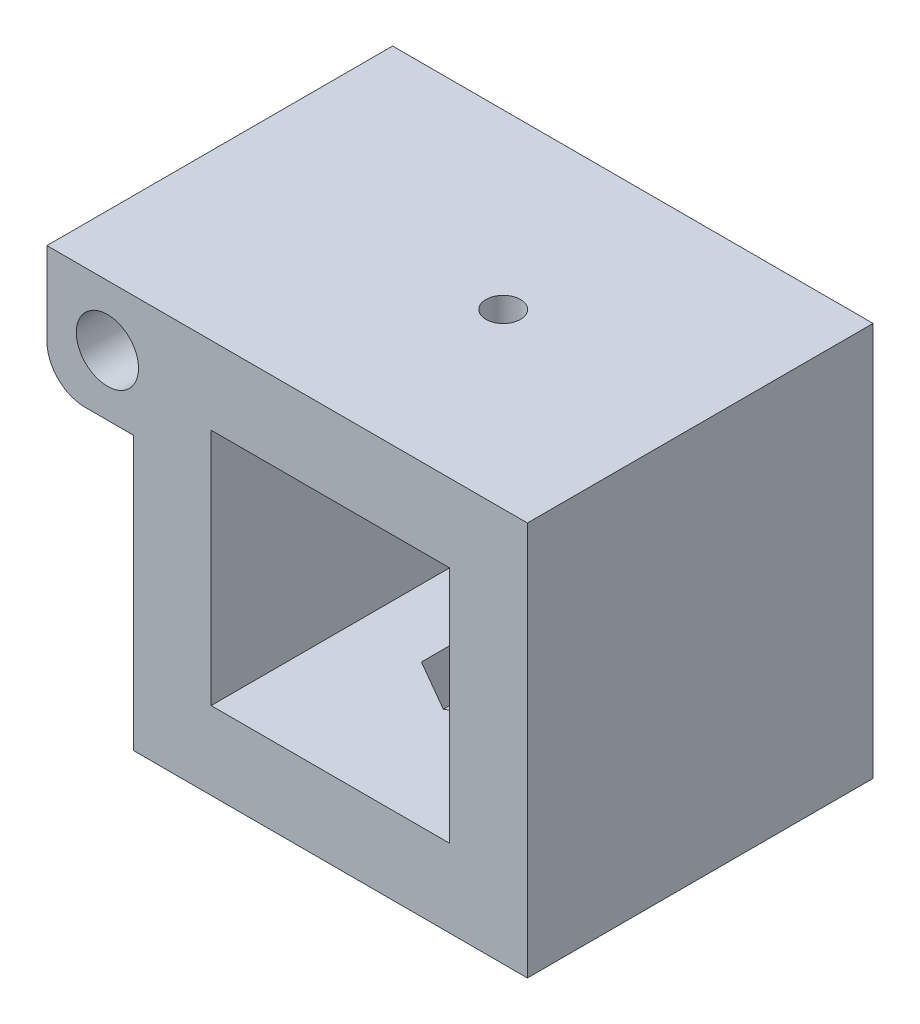
ISO-10303-21;
HEADER;
FILE_DESCRIPTION(('STEP AP214'),'2;1');
FILE_NAME('part.step','',(''),(''),'','','');
FILE_SCHEMA(('AUTOMOTIVE_DESIGN { 1 0 10303 214 1 1 1 1 }'));
ENDSEC;
DATA;
#1=APPLICATION_CONTEXT('core data for automotive mechanical design processes');
#2=APPLICATION_PROTOCOL_DEFINITION('international standard','automotive_design',2000,#1);
#3=PRODUCT_CONTEXT('',#1,'mechanical');
#4=PRODUCT('Part','Part','',(#3));
#5=PRODUCT_RELATED_PRODUCT_CATEGORY('part','',(#4));
#6=PRODUCT_DEFINITION_FORMATION('','',#4);
#7=PRODUCT_DEFINITION_CONTEXT('part definition',#1,'design');
#8=PRODUCT_DEFINITION('design','',#6,#7);
#9=PRODUCT_DEFINITION_SHAPE('','',#8);
#10=(LENGTH_UNIT() NAMED_UNIT(*) SI_UNIT(.MILLI.,.METRE.));
#11=(NAMED_UNIT(*) PLANE_ANGLE_UNIT() SI_UNIT($,.RADIAN.));
#12=(NAMED_UNIT(*) SI_UNIT($,.STERADIAN.) SOLID_ANGLE_UNIT());
#13=UNCERTAINTY_MEASURE_WITH_UNIT(LENGTH_MEASURE(1.E-05),#10,'distance_accuracy_value','');
#14=(GEOMETRIC_REPRESENTATION_CONTEXT(3) GLOBAL_UNCERTAINTY_ASSIGNED_CONTEXT((#13)) GLOBAL_UNIT_ASSIGNED_CONTEXT((#10,
#11,#12)) REPRESENTATION_CONTEXT('',''));
#15=CARTESIAN_POINT('',(0.,0.,0.));
#16=DIRECTION('',(0.,0.,1.));
#17=DIRECTION('',(1.,0.,0.));
#18=AXIS2_PLACEMENT_3D('',#15,#16,#17);
#19=CARTESIAN_POINT('',(0.,0.,10.));
#20=DIRECTION('',(0.,0.,1.));
#21=DIRECTION('',(1.,0.,0.));
#22=AXIS2_PLACEMENT_3D('',#19,#20,#21);
#23=PLANE('',#22);
#24=DIRECTION('',(-1.,0.,0.));
#25=VECTOR('',#24,1.);
#26=CARTESIAN_POINT('',(-6.9,6.9,10.));
#27=LINE('',#26,#25);
#28=CARTESIAN_POINT('',(6.9,6.9,10.));
#29=VERTEX_POINT('',#28);
#30=CARTESIAN_POINT('',(-6.9,6.9,10.));
#31=VERTEX_POINT('',#30);
#32=EDGE_CURVE('E246',#29,#31,#27,.T.);
#33=ORIENTED_EDGE('',*,*,#32,.F.);
#34=DIRECTION('',(0.,1.,0.));
#35=VECTOR('',#34,1.);
#36=CARTESIAN_POINT('',(6.9,-6.9,10.));
#37=LINE('',#36,#35);
#38=CARTESIAN_POINT('',(6.9,-6.9,10.));
#39=VERTEX_POINT('',#38);
#40=EDGE_CURVE('E244',#39,#29,#37,.T.);
#41=ORIENTED_EDGE('',*,*,#40,.F.);
#42=DIRECTION('',(1.,0.,0.));
#43=VECTOR('',#42,1.);
#44=CARTESIAN_POINT('',(-6.9,-6.9,10.));
#45=LINE('',#44,#43);
#46=CARTESIAN_POINT('',(-6.9,-6.9,10.));
#47=VERTEX_POINT('',#46);
#48=EDGE_CURVE('E252',#47,#39,#45,.T.);
#49=ORIENTED_EDGE('',*,*,#48,.F.);
#50=DIRECTION('',(0.,-1.,0.));
#51=VECTOR('',#50,1.);
#52=CARTESIAN_POINT('',(-6.9,-6.9,10.));
#53=LINE('',#52,#51);
#54=EDGE_CURVE('E249',#31,#47,#53,.T.);
#55=ORIENTED_EDGE('',*,*,#54,.F.);
#56=EDGE_LOOP('',(#33,#41,#49,#55));
#57=FACE_BOUND('',#56,.T.);
#58=DIRECTION('',(0.,-1.,0.));
#59=VECTOR('',#58,1.);
#60=CARTESIAN_POINT('',(-16.4,0.,10.));
#61=LINE('',#60,#59);
#62=CARTESIAN_POINT('',(-16.4,11.4,10.));
#63=VERTEX_POINT('',#62);
#64=CARTESIAN_POINT('',(-16.4,6.6,10.));
#65=VERTEX_POINT('',#64);
#66=EDGE_CURVE('E173',#63,#65,#61,.T.);
#67=ORIENTED_EDGE('',*,*,#66,.T.);
#68=CARTESIAN_POINT('',(-14.2,6.6,10.));
#69=DIRECTION('',(0.,0.,1.));
#70=DIRECTION('',(1.,0.,0.));
#71=AXIS2_PLACEMENT_3D('',#68,#69,#70);
#72=CIRCLE('',#71,2.2);
#73=CARTESIAN_POINT('',(-14.2,4.4,10.));
#74=VERTEX_POINT('',#73);
#75=EDGE_CURVE('E58',#65,#74,#72,.T.);
#76=ORIENTED_EDGE('',*,*,#75,.T.);
#77=DIRECTION('',(-1.,0.,0.));
#78=VECTOR('',#77,1.);
#79=CARTESIAN_POINT('',(0.,4.4,10.));
#80=LINE('',#79,#78);
#81=CARTESIAN_POINT('',(-11.4,4.4,10.));
#82=VERTEX_POINT('',#81);
#83=EDGE_CURVE('E180',#82,#74,#80,.T.);
#84=ORIENTED_EDGE('',*,*,#83,.F.);
#85=DIRECTION('',(0.,-1.,0.));
#86=VECTOR('',#85,1.);
#87=CARTESIAN_POINT('',(-11.4,-11.4,10.));
#88=LINE('',#87,#86);
#89=CARTESIAN_POINT('',(-11.4,-11.4,10.));
#90=VERTEX_POINT('',#89);
#91=EDGE_CURVE('E282',#82,#90,#88,.T.);
#92=ORIENTED_EDGE('',*,*,#91,.T.);
#93=DIRECTION('',(1.,0.,0.));
#94=VECTOR('',#93,1.);
#95=CARTESIAN_POINT('',(-11.4,-11.4,10.));
#96=LINE('',#95,#94);
#97=CARTESIAN_POINT('',(11.4,-11.4,10.));
#98=VERTEX_POINT('',#97);
#99=EDGE_CURVE('E275',#90,#98,#96,.T.);
#100=ORIENTED_EDGE('',*,*,#99,.T.);
#101=DIRECTION('',(0.,1.,0.));
#102=VECTOR('',#101,1.);
#103=CARTESIAN_POINT('',(11.4,-11.4,10.));
#104=LINE('',#103,#102);
#105=CARTESIAN_POINT('',(11.4,11.4,10.));
#106=VERTEX_POINT('',#105);
#107=EDGE_CURVE('E278',#98,#106,#104,.T.);
#108=ORIENTED_EDGE('',*,*,#107,.T.);
#109=DIRECTION('',(-1.,0.,0.));
#110=VECTOR('',#109,1.);
#111=CARTESIAN_POINT('',(-11.4,11.4,10.));
#112=LINE('',#111,#110);
#113=EDGE_CURVE('E280',#106,#63,#112,.T.);
#114=ORIENTED_EDGE('',*,*,#113,.T.);
#115=EDGE_LOOP('',(#67,#76,#84,#92,#100,#108,#114));
#116=FACE_BOUND('',#115,.T.);
#117=CARTESIAN_POINT('',(-12.9,7.9,10.));
#118=DIRECTION('',(0.,0.,-1.));
#119=DIRECTION('',(-1.,0.,0.));
#120=AXIS2_PLACEMENT_3D('',#117,#118,#119);
#121=CIRCLE('',#120,1.79999999999999);
#122=CARTESIAN_POINT('',(-14.7,7.9,10.));
#123=VERTEX_POINT('',#122);
#124=EDGE_CURVE('E185',#123,#123,#121,.T.);
#125=ORIENTED_EDGE('',*,*,#124,.T.);
#126=EDGE_LOOP('',(#125));
#127=FACE_BOUND('',#126,.T.);
#128=ADVANCED_FACE('F35',(#57,#116,#127),#23,.T.);
#129=CARTESIAN_POINT('',(0.,0.,-10.));
#130=DIRECTION('',(0.,0.,1.));
#131=DIRECTION('',(1.,0.,0.));
#132=AXIS2_PLACEMENT_3D('',#129,#130,#131);
#133=PLANE('',#132);
#134=DIRECTION('',(0.,1.,0.));
#135=VECTOR('',#134,1.);
#136=CARTESIAN_POINT('',(6.9,-6.9,-10.));
#137=LINE('',#136,#135);
#138=CARTESIAN_POINT('',(6.9,-6.9,-10.));
#139=VERTEX_POINT('',#138);
#140=CARTESIAN_POINT('',(6.9,6.9,-10.));
#141=VERTEX_POINT('',#140);
#142=EDGE_CURVE('E233',#139,#141,#137,.T.);
#143=ORIENTED_EDGE('',*,*,#142,.T.);
#144=DIRECTION('',(-1.,0.,0.));
#145=VECTOR('',#144,1.);
#146=CARTESIAN_POINT('',(-6.9,6.9,-10.));
#147=LINE('',#146,#145);
#148=CARTESIAN_POINT('',(-6.9,6.9,-10.));
#149=VERTEX_POINT('',#148);
#150=EDGE_CURVE('E257',#141,#149,#147,.T.);
#151=ORIENTED_EDGE('',*,*,#150,.T.);
#152=DIRECTION('',(0.,-1.,0.));
#153=VECTOR('',#152,1.);
#154=CARTESIAN_POINT('',(-6.9,-6.9,-10.));
#155=LINE('',#154,#153);
#156=CARTESIAN_POINT('',(-6.9,-6.9,-10.));
#157=VERTEX_POINT('',#156);
#158=EDGE_CURVE('E260',#149,#157,#155,.T.);
#159=ORIENTED_EDGE('',*,*,#158,.T.);
#160=DIRECTION('',(1.,0.,0.));
#161=VECTOR('',#160,1.);
#162=CARTESIAN_POINT('',(-6.9,-6.9,-10.));
#163=LINE('',#162,#161);
#164=EDGE_CURVE('E247',#157,#139,#163,.T.);
#165=ORIENTED_EDGE('',*,*,#164,.T.);
#166=EDGE_LOOP('',(#143,#151,#159,#165));
#167=FACE_BOUND('',#166,.T.);
#168=DIRECTION('',(-1.,0.,0.));
#169=VECTOR('',#168,1.);
#170=CARTESIAN_POINT('',(0.,4.4,-10.));
#171=LINE('',#170,#169);
#172=CARTESIAN_POINT('',(-11.4,4.4,-10.));
#173=VERTEX_POINT('',#172);
#174=CARTESIAN_POINT('',(-14.2,4.4,-10.));
#175=VERTEX_POINT('',#174);
#176=EDGE_CURVE('E175',#173,#175,#171,.T.);
#177=ORIENTED_EDGE('',*,*,#176,.T.);
#178=CARTESIAN_POINT('',(-14.2,6.6,-10.));
#179=DIRECTION('',(0.,0.,1.));
#180=DIRECTION('',(1.,0.,0.));
#181=AXIS2_PLACEMENT_3D('',#178,#179,#180);
#182=CIRCLE('',#181,2.2);
#183=CARTESIAN_POINT('',(-16.4,6.6,-10.));
#184=VERTEX_POINT('',#183);
#185=EDGE_CURVE('E11',#175,#184,#182,.F.);
#186=ORIENTED_EDGE('',*,*,#185,.T.);
#187=DIRECTION('',(0.,-1.,0.));
#188=VECTOR('',#187,1.);
#189=CARTESIAN_POINT('',(-16.4,0.,-10.));
#190=LINE('',#189,#188);
#191=CARTESIAN_POINT('',(-16.4,11.4,-10.));
#192=VERTEX_POINT('',#191);
#193=EDGE_CURVE('E171',#192,#184,#190,.T.);
#194=ORIENTED_EDGE('',*,*,#193,.F.);
#195=DIRECTION('',(-1.,0.,0.));
#196=VECTOR('',#195,1.);
#197=CARTESIAN_POINT('',(-11.4,11.4,-10.));
#198=LINE('',#197,#196);
#199=CARTESIAN_POINT('',(11.4,11.4,-10.));
#200=VERTEX_POINT('',#199);
#201=EDGE_CURVE('E154',#200,#192,#198,.T.);
#202=ORIENTED_EDGE('',*,*,#201,.F.);
#203=DIRECTION('',(0.,1.,0.));
#204=VECTOR('',#203,1.);
#205=CARTESIAN_POINT('',(11.4,-11.4,-10.));
#206=LINE('',#205,#204);
#207=CARTESIAN_POINT('',(11.4,-11.4,-10.));
#208=VERTEX_POINT('',#207);
#209=EDGE_CURVE('E165',#208,#200,#206,.T.);
#210=ORIENTED_EDGE('',*,*,#209,.F.);
#211=DIRECTION('',(1.,0.,0.));
#212=VECTOR('',#211,1.);
#213=CARTESIAN_POINT('',(-11.4,-11.4,-10.));
#214=LINE('',#213,#212);
#215=CARTESIAN_POINT('',(-11.4,-11.4,-10.));
#216=VERTEX_POINT('',#215);
#217=EDGE_CURVE('E274',#216,#208,#214,.T.);
#218=ORIENTED_EDGE('',*,*,#217,.F.);
#219=DIRECTION('',(0.,-1.,0.));
#220=VECTOR('',#219,1.);
#221=CARTESIAN_POINT('',(-11.4,-11.4,-10.));
#222=LINE('',#221,#220);
#223=EDGE_CURVE('E164',#173,#216,#222,.T.);
#224=ORIENTED_EDGE('',*,*,#223,.F.);
#225=EDGE_LOOP('',(#177,#186,#194,#202,#210,#218,#224));
#226=FACE_BOUND('',#225,.T.);
#227=CARTESIAN_POINT('',(-12.9,7.9,-10.));
#228=DIRECTION('',(0.,0.,-1.));
#229=DIRECTION('',(-1.,0.,0.));
#230=AXIS2_PLACEMENT_3D('',#227,#228,#229);
#231=CIRCLE('',#230,3.25);
#232=CARTESIAN_POINT('',(-16.15,7.9,-10.));
#233=VERTEX_POINT('',#232);
#234=EDGE_CURVE('E417',#233,#233,#231,.T.);
#235=ORIENTED_EDGE('',*,*,#234,.F.);
#236=EDGE_LOOP('',(#235));
#237=FACE_BOUND('',#236,.T.);
#238=ADVANCED_FACE('F177',(#167,#226,#237),#133,.F.);
#239=CARTESIAN_POINT('',(-11.4,-11.4,10.));
#240=DIRECTION('',(1.,0.,0.));
#241=DIRECTION('',(0.,0.,-1.));
#242=AXIS2_PLACEMENT_3D('',#239,#240,#241);
#243=PLANE('',#242);
#244=DIRECTION('',(0.,0.,1.));
#245=VECTOR('',#244,1.);
#246=CARTESIAN_POINT('',(-11.4,4.4,-10.));
#247=LINE('',#246,#245);
#248=EDGE_CURVE('E174',#173,#82,#247,.T.);
#249=ORIENTED_EDGE('',*,*,#248,.F.);
#250=ORIENTED_EDGE('',*,*,#223,.T.);
#251=DIRECTION('',(0.,0.,-1.));
#252=VECTOR('',#251,1.);
#253=CARTESIAN_POINT('',(-11.4,-11.4,10.));
#254=LINE('',#253,#252);
#255=EDGE_CURVE('E284',#90,#216,#254,.T.);
#256=ORIENTED_EDGE('',*,*,#255,.F.);
#257=ORIENTED_EDGE('',*,*,#91,.F.);
#258=EDGE_LOOP('',(#249,#250,#256,#257));
#259=FACE_BOUND('',#258,.T.);
#260=ADVANCED_FACE('F314',(#259),#243,.F.);
#261=CARTESIAN_POINT('',(-11.4,-11.4,10.));
#262=DIRECTION('',(0.,1.,0.));
#263=DIRECTION('',(0.,0.,1.));
#264=AXIS2_PLACEMENT_3D('',#261,#262,#263);
#265=PLANE('',#264);
#266=CARTESIAN_POINT('',(0.,-11.4,0.));
#267=DIRECTION('',(0.,1.,0.));
#268=DIRECTION('',(0.,0.,1.));
#269=AXIS2_PLACEMENT_3D('',#266,#267,#268);
#270=CIRCLE('',#269,1.75);
#271=CARTESIAN_POINT('',(0.,-11.4,1.75));
#272=VERTEX_POINT('',#271);
#273=EDGE_CURVE('E194',#272,#272,#270,.T.);
#274=ORIENTED_EDGE('',*,*,#273,.T.);
#275=EDGE_LOOP('',(#274));
#276=FACE_BOUND('',#275,.T.);
#277=ORIENTED_EDGE('',*,*,#217,.T.);
#278=DIRECTION('',(0.,0.,-1.));
#279=VECTOR('',#278,1.);
#280=CARTESIAN_POINT('',(11.4,-11.4,10.));
#281=LINE('',#280,#279);
#282=EDGE_CURVE('E292',#98,#208,#281,.T.);
#283=ORIENTED_EDGE('',*,*,#282,.F.);
#284=ORIENTED_EDGE('',*,*,#99,.F.);
#285=ORIENTED_EDGE('',*,*,#255,.T.);
#286=EDGE_LOOP('',(#277,#283,#284,#285));
#287=FACE_BOUND('',#286,.T.);
#288=ADVANCED_FACE('F309',(#276,#287),#265,.F.);
#289=CARTESIAN_POINT('',(11.4,-11.4,10.));
#290=DIRECTION('',(-1.,0.,0.));
#291=DIRECTION('',(0.,-1.,0.));
#292=AXIS2_PLACEMENT_3D('',#289,#290,#291);
#293=PLANE('',#292);
#294=ORIENTED_EDGE('',*,*,#209,.T.);
#295=DIRECTION('',(0.,0.,-1.));
#296=VECTOR('',#295,1.);
#297=CARTESIAN_POINT('',(11.4,11.4,10.));
#298=LINE('',#297,#296);
#299=EDGE_CURVE('E161',#106,#200,#298,.T.);
#300=ORIENTED_EDGE('',*,*,#299,.F.);
#301=ORIENTED_EDGE('',*,*,#107,.F.);
#302=ORIENTED_EDGE('',*,*,#282,.T.);
#303=EDGE_LOOP('',(#294,#300,#301,#302));
#304=FACE_BOUND('',#303,.T.);
#305=ADVANCED_FACE('F305',(#304),#293,.F.);
#306=CARTESIAN_POINT('',(-11.4,11.4,10.));
#307=DIRECTION('',(0.,-1.,0.));
#308=DIRECTION('',(0.,0.,-1.));
#309=AXIS2_PLACEMENT_3D('',#306,#307,#308);
#310=PLANE('',#309);
#311=CARTESIAN_POINT('',(0.,11.4,0.));
#312=DIRECTION('',(0.,1.,0.));
#313=DIRECTION('',(0.,0.,1.));
#314=AXIS2_PLACEMENT_3D('',#311,#312,#313);
#315=CIRCLE('',#314,1.);
#316=CARTESIAN_POINT('',(0.,11.4,1.));
#317=VERTEX_POINT('',#316);
#318=EDGE_CURVE('E418',#317,#317,#315,.T.);
#319=ORIENTED_EDGE('',*,*,#318,.F.);
#320=EDGE_LOOP('',(#319));
#321=FACE_BOUND('',#320,.T.);
#322=ORIENTED_EDGE('',*,*,#201,.T.);
#323=DIRECTION('',(0.,0.,1.));
#324=VECTOR('',#323,1.);
#325=CARTESIAN_POINT('',(-16.4,11.4,-10.));
#326=LINE('',#325,#324);
#327=EDGE_CURVE('E158',#192,#63,#326,.T.);
#328=ORIENTED_EDGE('',*,*,#327,.T.);
#329=ORIENTED_EDGE('',*,*,#113,.F.);
#330=ORIENTED_EDGE('',*,*,#299,.T.);
#331=EDGE_LOOP('',(#322,#328,#329,#330));
#332=FACE_BOUND('',#331,.T.);
#333=ADVANCED_FACE('F156',(#321,#332),#310,.F.);
#334=CARTESIAN_POINT('',(6.9,-6.9,10.));
#335=DIRECTION('',(-1.,0.,0.));
#336=DIRECTION('',(0.,0.,1.));
#337=AXIS2_PLACEMENT_3D('',#334,#335,#336);
#338=PLANE('',#337);
#339=ORIENTED_EDGE('',*,*,#142,.F.);
#340=DIRECTION('',(0.,0.,-1.));
#341=VECTOR('',#340,1.);
#342=CARTESIAN_POINT('',(6.9,-6.9,10.));
#343=LINE('',#342,#341);
#344=EDGE_CURVE('E254',#39,#139,#343,.T.);
#345=ORIENTED_EDGE('',*,*,#344,.F.);
#346=ORIENTED_EDGE('',*,*,#40,.T.);
#347=DIRECTION('',(0.,0.,-1.));
#348=VECTOR('',#347,1.);
#349=CARTESIAN_POINT('',(6.9,6.9,10.));
#350=LINE('',#349,#348);
#351=EDGE_CURVE('E271',#29,#141,#350,.T.);
#352=ORIENTED_EDGE('',*,*,#351,.T.);
#353=EDGE_LOOP('',(#339,#345,#346,#352));
#354=FACE_BOUND('',#353,.T.);
#355=ADVANCED_FACE('F338',(#354),#338,.T.);
#356=CARTESIAN_POINT('',(-6.9,6.9,10.));
#357=DIRECTION('',(0.,-1.,0.));
#358=DIRECTION('',(0.,0.,-1.));
#359=AXIS2_PLACEMENT_3D('',#356,#357,#358);
#360=PLANE('',#359);
#361=CARTESIAN_POINT('',(0.,6.9,0.));
#362=DIRECTION('',(0.,-1.,0.));
#363=DIRECTION('',(0.,0.,-1.));
#364=AXIS2_PLACEMENT_3D('',#361,#362,#363);
#365=CIRCLE('',#364,1.);
#366=CARTESIAN_POINT('',(0.,6.9,-1.));
#367=VERTEX_POINT('',#366);
#368=EDGE_CURVE('E39',#367,#367,#365,.T.);
#369=ORIENTED_EDGE('',*,*,#368,.F.);
#370=EDGE_LOOP('',(#369));
#371=FACE_BOUND('',#370,.T.);
#372=ORIENTED_EDGE('',*,*,#150,.F.);
#373=ORIENTED_EDGE('',*,*,#351,.F.);
#374=ORIENTED_EDGE('',*,*,#32,.T.);
#375=DIRECTION('',(0.,0.,-1.));
#376=VECTOR('',#375,1.);
#377=CARTESIAN_POINT('',(-6.9,6.9,10.));
#378=LINE('',#377,#376);
#379=EDGE_CURVE('E269',#31,#149,#378,.T.);
#380=ORIENTED_EDGE('',*,*,#379,.T.);
#381=EDGE_LOOP('',(#372,#373,#374,#380));
#382=FACE_BOUND('',#381,.T.);
#383=ADVANCED_FACE('F397',(#371,#382),#360,.T.);
#384=CARTESIAN_POINT('',(-6.9,-6.9,10.));
#385=DIRECTION('',(1.,0.,0.));
#386=DIRECTION('',(0.,0.,-1.));
#387=AXIS2_PLACEMENT_3D('',#384,#385,#386);
#388=PLANE('',#387);
#389=ORIENTED_EDGE('',*,*,#158,.F.);
#390=ORIENTED_EDGE('',*,*,#379,.F.);
#391=ORIENTED_EDGE('',*,*,#54,.T.);
#392=DIRECTION('',(0.,0.,-1.));
#393=VECTOR('',#392,1.);
#394=CARTESIAN_POINT('',(-6.9,-6.9,10.));
#395=LINE('',#394,#393);
#396=EDGE_CURVE('E267',#47,#157,#395,.T.);
#397=ORIENTED_EDGE('',*,*,#396,.T.);
#398=EDGE_LOOP('',(#389,#390,#391,#397));
#399=FACE_BOUND('',#398,.T.);
#400=ADVANCED_FACE('F394',(#399),#388,.T.);
#401=CARTESIAN_POINT('',(-6.9,-6.9,10.));
#402=DIRECTION('',(0.,1.,0.));
#403=DIRECTION('',(0.,0.,1.));
#404=AXIS2_PLACEMENT_3D('',#401,#402,#403);
#405=PLANE('',#404);
#406=DIRECTION('',(0.866025403784438,0.,-0.5));
#407=VECTOR('',#406,1.);
#408=CARTESIAN_POINT('',(0.,-6.9,3.46410161513775));
#409=LINE('',#408,#407);
#410=CARTESIAN_POINT('',(0.,-6.9,3.46410161513775));
#411=VERTEX_POINT('',#410);
#412=CARTESIAN_POINT('',(3.,-6.9,1.73205080756888));
#413=VERTEX_POINT('',#412);
#414=EDGE_CURVE('E215',#411,#413,#409,.T.);
#415=ORIENTED_EDGE('',*,*,#414,.F.);
#416=DIRECTION('',(0.866025403784439,0.,0.5));
#417=VECTOR('',#416,1.);
#418=CARTESIAN_POINT('',(-3.,-6.9,1.73205080756888));
#419=LINE('',#418,#417);
#420=CARTESIAN_POINT('',(-3.,-6.9,1.73205080756888));
#421=VERTEX_POINT('',#420);
#422=EDGE_CURVE('E199',#421,#411,#419,.T.);
#423=ORIENTED_EDGE('',*,*,#422,.F.);
#424=DIRECTION('',(0.,0.,1.));
#425=VECTOR('',#424,1.);
#426=CARTESIAN_POINT('',(-3.,-6.9,-1.73205080756888));
#427=LINE('',#426,#425);
#428=CARTESIAN_POINT('',(-3.,-6.9,-1.73205080756888));
#429=VERTEX_POINT('',#428);
#430=EDGE_CURVE('E226',#429,#421,#427,.T.);
#431=ORIENTED_EDGE('',*,*,#430,.F.);
#432=DIRECTION('',(-0.866025403784438,0.,0.5));
#433=VECTOR('',#432,1.);
#434=CARTESIAN_POINT('',(0.,-6.9,-3.46410161513775));
#435=LINE('',#434,#433);
#436=CARTESIAN_POINT('',(0.,-6.9,-3.46410161513775));
#437=VERTEX_POINT('',#436);
#438=EDGE_CURVE('E223',#437,#429,#435,.T.);
#439=ORIENTED_EDGE('',*,*,#438,.F.);
#440=DIRECTION('',(-0.866025403784439,0.,-0.5));
#441=VECTOR('',#440,1.);
#442=CARTESIAN_POINT('',(3.,-6.9,-1.73205080756888));
#443=LINE('',#442,#441);
#444=CARTESIAN_POINT('',(3.,-6.9,-1.73205080756888));
#445=VERTEX_POINT('',#444);
#446=EDGE_CURVE('E220',#445,#437,#443,.T.);
#447=ORIENTED_EDGE('',*,*,#446,.F.);
#448=DIRECTION('',(0.,0.,-1.));
#449=VECTOR('',#448,1.);
#450=CARTESIAN_POINT('',(3.,-6.9,1.73205080756888));
#451=LINE('',#450,#449);
#452=EDGE_CURVE('E217',#413,#445,#451,.T.);
#453=ORIENTED_EDGE('',*,*,#452,.F.);
#454=EDGE_LOOP('',(#415,#423,#431,#439,#447,#453));
#455=FACE_BOUND('',#454,.T.);
#456=ORIENTED_EDGE('',*,*,#164,.F.);
#457=ORIENTED_EDGE('',*,*,#396,.F.);
#458=ORIENTED_EDGE('',*,*,#48,.T.);
#459=ORIENTED_EDGE('',*,*,#344,.T.);
#460=EDGE_LOOP('',(#456,#457,#458,#459));
#461=FACE_BOUND('',#460,.T.);
#462=ADVANCED_FACE('F390',(#455,#461),#405,.T.);
#463=CARTESIAN_POINT('',(0.,-9.9,3.46410161513775));
#464=DIRECTION('',(0.5,0.,0.866025403784439));
#465=DIRECTION('',(0.866025403784439,0.,-0.5));
#466=AXIS2_PLACEMENT_3D('',#463,#464,#465);
#467=PLANE('',#466);
#468=ORIENTED_EDGE('',*,*,#414,.T.);
#469=DIRECTION('',(0.,1.,0.));
#470=VECTOR('',#469,1.);
#471=CARTESIAN_POINT('',(3.,-9.9,1.73205080756888));
#472=LINE('',#471,#470);
#473=CARTESIAN_POINT('',(3.,-9.9,1.73205080756888));
#474=VERTEX_POINT('',#473);
#475=EDGE_CURVE('E214',#474,#413,#472,.T.);
#476=ORIENTED_EDGE('',*,*,#475,.F.);
#477=DIRECTION('',(0.866025403784438,0.,-0.5));
#478=VECTOR('',#477,1.);
#479=CARTESIAN_POINT('',(0.,-9.9,3.46410161513775));
#480=LINE('',#479,#478);
#481=CARTESIAN_POINT('',(0.,-9.9,3.46410161513775));
#482=VERTEX_POINT('',#481);
#483=EDGE_CURVE('E195',#482,#474,#480,.T.);
#484=ORIENTED_EDGE('',*,*,#483,.F.);
#485=DIRECTION('',(0.,1.,0.));
#486=VECTOR('',#485,1.);
#487=CARTESIAN_POINT('',(0.,-9.9,3.46410161513775));
#488=LINE('',#487,#486);
#489=EDGE_CURVE('E231',#482,#411,#488,.T.);
#490=ORIENTED_EDGE('',*,*,#489,.T.);
#491=EDGE_LOOP('',(#468,#476,#484,#490));
#492=FACE_BOUND('',#491,.T.);
#493=ADVANCED_FACE('F372',(#492),#467,.F.);
#494=CARTESIAN_POINT('',(-3.,-9.9,1.73205080756888));
#495=DIRECTION('',(-0.5,0.,0.866025403784439));
#496=DIRECTION('',(0.866025403784439,0.,0.5));
#497=AXIS2_PLACEMENT_3D('',#494,#495,#496);
#498=PLANE('',#497);
#499=ORIENTED_EDGE('',*,*,#422,.T.);
#500=ORIENTED_EDGE('',*,*,#489,.F.);
#501=DIRECTION('',(0.866025403784439,0.,0.5));
#502=VECTOR('',#501,1.);
#503=CARTESIAN_POINT('',(-3.,-9.9,1.73205080756888));
#504=LINE('',#503,#502);
#505=CARTESIAN_POINT('',(-3.,-9.9,1.73205080756888));
#506=VERTEX_POINT('',#505);
#507=EDGE_CURVE('E211',#506,#482,#504,.T.);
#508=ORIENTED_EDGE('',*,*,#507,.F.);
#509=DIRECTION('',(0.,1.,0.));
#510=VECTOR('',#509,1.);
#511=CARTESIAN_POINT('',(-3.,-9.9,1.73205080756888));
#512=LINE('',#511,#510);
#513=EDGE_CURVE('E234',#506,#421,#512,.T.);
#514=ORIENTED_EDGE('',*,*,#513,.T.);
#515=EDGE_LOOP('',(#499,#500,#508,#514));
#516=FACE_BOUND('',#515,.T.);
#517=ADVANCED_FACE('F368',(#516),#498,.F.);
#518=CARTESIAN_POINT('',(-3.,-9.9,-1.73205080756888));
#519=DIRECTION('',(-1.,0.,0.));
#520=DIRECTION('',(0.,0.,1.));
#521=AXIS2_PLACEMENT_3D('',#518,#519,#520);
#522=PLANE('',#521);
#523=ORIENTED_EDGE('',*,*,#430,.T.);
#524=ORIENTED_EDGE('',*,*,#513,.F.);
#525=DIRECTION('',(0.,0.,1.));
#526=VECTOR('',#525,1.);
#527=CARTESIAN_POINT('',(-3.,-9.9,-1.73205080756888));
#528=LINE('',#527,#526);
#529=CARTESIAN_POINT('',(-3.,-9.9,-1.73205080756888));
#530=VERTEX_POINT('',#529);
#531=EDGE_CURVE('E208',#530,#506,#528,.T.);
#532=ORIENTED_EDGE('',*,*,#531,.F.);
#533=DIRECTION('',(0.,1.,0.));
#534=VECTOR('',#533,1.);
#535=CARTESIAN_POINT('',(-3.,-9.9,-1.73205080756888));
#536=LINE('',#535,#534);
#537=EDGE_CURVE('E236',#530,#429,#536,.T.);
#538=ORIENTED_EDGE('',*,*,#537,.T.);
#539=EDGE_LOOP('',(#523,#524,#532,#538));
#540=FACE_BOUND('',#539,.T.);
#541=ADVANCED_FACE('F371',(#540),#522,.F.);
#542=CARTESIAN_POINT('',(0.,-9.9,-3.46410161513775));
#543=DIRECTION('',(-0.5,0.,-0.866025403784438));
#544=DIRECTION('',(-0.866025403784438,0.,0.5));
#545=AXIS2_PLACEMENT_3D('',#542,#543,#544);
#546=PLANE('',#545);
#547=ORIENTED_EDGE('',*,*,#438,.T.);
#548=ORIENTED_EDGE('',*,*,#537,.F.);
#549=DIRECTION('',(-0.866025403784438,0.,0.5));
#550=VECTOR('',#549,1.);
#551=CARTESIAN_POINT('',(0.,-9.9,-3.46410161513775));
#552=LINE('',#551,#550);
#553=CARTESIAN_POINT('',(0.,-9.9,-3.46410161513775));
#554=VERTEX_POINT('',#553);
#555=EDGE_CURVE('E205',#554,#530,#552,.T.);
#556=ORIENTED_EDGE('',*,*,#555,.F.);
#557=DIRECTION('',(0.,1.,0.));
#558=VECTOR('',#557,1.);
#559=CARTESIAN_POINT('',(0.,-9.9,-3.46410161513775));
#560=LINE('',#559,#558);
#561=EDGE_CURVE('E238',#554,#437,#560,.T.);
#562=ORIENTED_EDGE('',*,*,#561,.T.);
#563=EDGE_LOOP('',(#547,#548,#556,#562));
#564=FACE_BOUND('',#563,.T.);
#565=ADVANCED_FACE('F376',(#564),#546,.F.);
#566=CARTESIAN_POINT('',(3.,-9.9,-1.73205080756888));
#567=DIRECTION('',(0.5,0.,-0.866025403784439));
#568=DIRECTION('',(-0.866025403784439,0.,-0.5));
#569=AXIS2_PLACEMENT_3D('',#566,#567,#568);
#570=PLANE('',#569);
#571=ORIENTED_EDGE('',*,*,#446,.T.);
#572=ORIENTED_EDGE('',*,*,#561,.F.);
#573=DIRECTION('',(-0.866025403784439,0.,-0.5));
#574=VECTOR('',#573,1.);
#575=CARTESIAN_POINT('',(3.,-9.9,-1.73205080756888));
#576=LINE('',#575,#574);
#577=CARTESIAN_POINT('',(3.,-9.9,-1.73205080756888));
#578=VERTEX_POINT('',#577);
#579=EDGE_CURVE('E202',#578,#554,#576,.T.);
#580=ORIENTED_EDGE('',*,*,#579,.F.);
#581=DIRECTION('',(0.,1.,0.));
#582=VECTOR('',#581,1.);
#583=CARTESIAN_POINT('',(3.,-9.9,-1.73205080756888));
#584=LINE('',#583,#582);
#585=EDGE_CURVE('E240',#578,#445,#584,.T.);
#586=ORIENTED_EDGE('',*,*,#585,.T.);
#587=EDGE_LOOP('',(#571,#572,#580,#586));
#588=FACE_BOUND('',#587,.T.);
#589=ADVANCED_FACE('F380',(#588),#570,.F.);
#590=CARTESIAN_POINT('',(3.,-9.9,1.73205080756888));
#591=DIRECTION('',(1.,0.,0.));
#592=DIRECTION('',(0.,0.,-1.));
#593=AXIS2_PLACEMENT_3D('',#590,#591,#592);
#594=PLANE('',#593);
#595=ORIENTED_EDGE('',*,*,#452,.T.);
#596=ORIENTED_EDGE('',*,*,#585,.F.);
#597=DIRECTION('',(0.,0.,-1.));
#598=VECTOR('',#597,1.);
#599=CARTESIAN_POINT('',(3.,-9.9,1.73205080756888));
#600=LINE('',#599,#598);
#601=EDGE_CURVE('E198',#474,#578,#600,.T.);
#602=ORIENTED_EDGE('',*,*,#601,.F.);
#603=ORIENTED_EDGE('',*,*,#475,.T.);
#604=EDGE_LOOP('',(#595,#596,#602,#603));
#605=FACE_BOUND('',#604,.T.);
#606=ADVANCED_FACE('F363',(#605),#594,.F.);
#607=CARTESIAN_POINT('',(0.,-9.9,0.));
#608=DIRECTION('',(0.,1.,0.));
#609=DIRECTION('',(0.,0.,1.));
#610=AXIS2_PLACEMENT_3D('',#607,#608,#609);
#611=PLANE('',#610);
#612=CARTESIAN_POINT('',(0.,-9.9,0.));
#613=DIRECTION('',(0.,1.,0.));
#614=DIRECTION('',(0.,0.,1.));
#615=AXIS2_PLACEMENT_3D('',#612,#613,#614);
#616=CIRCLE('',#615,1.75);
#617=CARTESIAN_POINT('',(0.,-9.9,1.75));
#618=VERTEX_POINT('',#617);
#619=EDGE_CURVE('E190',#618,#618,#616,.T.);
#620=ORIENTED_EDGE('',*,*,#619,.F.);
#621=EDGE_LOOP('',(#620));
#622=FACE_BOUND('',#621,.T.);
#623=ORIENTED_EDGE('',*,*,#483,.T.);
#624=ORIENTED_EDGE('',*,*,#601,.T.);
#625=ORIENTED_EDGE('',*,*,#579,.T.);
#626=ORIENTED_EDGE('',*,*,#555,.T.);
#627=ORIENTED_EDGE('',*,*,#531,.T.);
#628=ORIENTED_EDGE('',*,*,#507,.T.);
#629=EDGE_LOOP('',(#623,#624,#625,#626,#627,#628));
#630=FACE_BOUND('',#629,.T.);
#631=ADVANCED_FACE('F355',(#622,#630),#611,.T.);
#632=CARTESIAN_POINT('',(0.,-12.9,0.));
#633=DIRECTION('',(0.,1.,0.));
#634=DIRECTION('',(0.,0.,1.));
#635=AXIS2_PLACEMENT_3D('',#632,#633,#634);
#636=CYLINDRICAL_SURFACE('',#635,1.75);
#637=ORIENTED_EDGE('',*,*,#619,.T.);
#638=EDGE_LOOP('',(#637));
#639=FACE_BOUND('',#638,.T.);
#640=ORIENTED_EDGE('',*,*,#273,.F.);
#641=EDGE_LOOP('',(#640));
#642=FACE_BOUND('',#641,.T.);
#643=ADVANCED_FACE('F353',(#639,#642),#636,.F.);
#644=CARTESIAN_POINT('',(0.,4.4,-10.));
#645=DIRECTION('',(0.,1.,0.));
#646=DIRECTION('',(0.,0.,1.));
#647=AXIS2_PLACEMENT_3D('',#644,#645,#646);
#648=PLANE('',#647);
#649=ORIENTED_EDGE('',*,*,#83,.T.);
#650=DIRECTION('',(0.,0.,1.));
#651=VECTOR('',#650,1.);
#652=CARTESIAN_POINT('',(-14.2,4.4,-10.));
#653=LINE('',#652,#651);
#654=EDGE_CURVE('E44',#74,#175,#653,.F.);
#655=ORIENTED_EDGE('',*,*,#654,.T.);
#656=ORIENTED_EDGE('',*,*,#176,.F.);
#657=ORIENTED_EDGE('',*,*,#248,.T.);
#658=EDGE_LOOP('',(#649,#655,#656,#657));
#659=FACE_BOUND('',#658,.T.);
#660=ADVANCED_FACE('F315',(#659),#648,.F.);
#661=CARTESIAN_POINT('',(-16.4,0.,-10.));
#662=DIRECTION('',(-1.,0.,0.));
#663=DIRECTION('',(0.,0.,1.));
#664=AXIS2_PLACEMENT_3D('',#661,#662,#663);
#665=PLANE('',#664);
#666=ORIENTED_EDGE('',*,*,#193,.T.);
#667=DIRECTION('',(0.,0.,1.));
#668=VECTOR('',#667,1.);
#669=CARTESIAN_POINT('',(-16.4,6.6,10.));
#670=LINE('',#669,#668);
#671=EDGE_CURVE('E295',#184,#65,#670,.T.);
#672=ORIENTED_EDGE('',*,*,#671,.T.);
#673=ORIENTED_EDGE('',*,*,#66,.F.);
#674=ORIENTED_EDGE('',*,*,#327,.F.);
#675=EDGE_LOOP('',(#666,#672,#673,#674));
#676=FACE_BOUND('',#675,.T.);
#677=ADVANCED_FACE('F169',(#676),#665,.T.);
#678=CARTESIAN_POINT('',(-12.9,7.9,-10.));
#679=DIRECTION('',(0.,0.,-1.));
#680=DIRECTION('',(-1.,0.,0.));
#681=AXIS2_PLACEMENT_3D('',#678,#679,#680);
#682=CYLINDRICAL_SURFACE('',#681,1.8);
#683=ORIENTED_EDGE('',*,*,#124,.F.);
#684=EDGE_LOOP('',(#683));
#685=FACE_BOUND('',#684,.T.);
#686=CARTESIAN_POINT('',(-12.9,7.9,-8.));
#687=DIRECTION('',(0.,0.,-1.));
#688=DIRECTION('',(-1.,0.,0.));
#689=AXIS2_PLACEMENT_3D('',#686,#687,#688);
#690=CIRCLE('',#689,1.80000000000001);
#691=CARTESIAN_POINT('',(-14.7,7.9,-8.));
#692=VERTEX_POINT('',#691);
#693=EDGE_CURVE('E428',#692,#692,#690,.T.);
#694=ORIENTED_EDGE('',*,*,#693,.T.);
#695=EDGE_LOOP('',(#694));
#696=FACE_BOUND('',#695,.T.);
#697=ADVANCED_FACE('F435',(#685,#696),#682,.F.);
#698=CARTESIAN_POINT('',(-11.1,7.9,-8.));
#699=DIRECTION('',(0.,0.,1.));
#700=DIRECTION('',(1.,0.,0.));
#701=AXIS2_PLACEMENT_3D('',#698,#699,#700);
#702=PLANE('',#701);
#703=ORIENTED_EDGE('',*,*,#693,.F.);
#704=EDGE_LOOP('',(#703));
#705=FACE_BOUND('',#704,.T.);
#706=CARTESIAN_POINT('',(-12.9,7.9,-8.));
#707=DIRECTION('',(0.,0.,-1.));
#708=DIRECTION('',(-1.,0.,0.));
#709=AXIS2_PLACEMENT_3D('',#706,#707,#708);
#710=CIRCLE('',#709,3.25);
#711=CARTESIAN_POINT('',(-16.15,7.9,-8.));
#712=VERTEX_POINT('',#711);
#713=EDGE_CURVE('E420',#712,#712,#710,.T.);
#714=ORIENTED_EDGE('',*,*,#713,.T.);
#715=EDGE_LOOP('',(#714));
#716=FACE_BOUND('',#715,.T.);
#717=ADVANCED_FACE('F325',(#705,#716),#702,.F.);
#718=CARTESIAN_POINT('',(-12.9,7.9,-10.));
#719=DIRECTION('',(0.,0.,-1.));
#720=DIRECTION('',(-1.,0.,0.));
#721=AXIS2_PLACEMENT_3D('',#718,#719,#720);
#722=CYLINDRICAL_SURFACE('',#721,3.25);
#723=ORIENTED_EDGE('',*,*,#713,.F.);
#724=EDGE_LOOP('',(#723));
#725=FACE_BOUND('',#724,.T.);
#726=ORIENTED_EDGE('',*,*,#234,.T.);
#727=EDGE_LOOP('',(#726));
#728=FACE_BOUND('',#727,.T.);
#729=ADVANCED_FACE('F318',(#725,#728),#722,.F.);
#730=CARTESIAN_POINT('',(-14.2,6.6,-10.));
#731=DIRECTION('',(0.,0.,-1.));
#732=DIRECTION('',(-1.,0.,0.));
#733=AXIS2_PLACEMENT_3D('',#730,#731,#732);
#734=CYLINDRICAL_SURFACE('',#733,2.2);
#735=ORIENTED_EDGE('',*,*,#185,.F.);
#736=ORIENTED_EDGE('',*,*,#654,.F.);
#737=ORIENTED_EDGE('',*,*,#75,.F.);
#738=ORIENTED_EDGE('',*,*,#671,.F.);
#739=EDGE_LOOP('',(#735,#736,#737,#738));
#740=FACE_BOUND('',#739,.T.);
#741=ADVANCED_FACE('F37',(#740),#734,.T.);
#742=CARTESIAN_POINT('',(0.,1.4,0.));
#743=DIRECTION('',(0.,1.,0.));
#744=DIRECTION('',(0.,0.,1.));
#745=AXIS2_PLACEMENT_3D('',#742,#743,#744);
#746=CYLINDRICAL_SURFACE('',#745,1.);
#747=ORIENTED_EDGE('',*,*,#368,.T.);
#748=EDGE_LOOP('',(#747));
#749=FACE_BOUND('',#748,.T.);
#750=ORIENTED_EDGE('',*,*,#318,.T.);
#751=EDGE_LOOP('',(#750));
#752=FACE_BOUND('',#751,.T.);
#753=ADVANCED_FACE('F317',(#749,#752),#746,.F.);
#754=CLOSED_SHELL('',(#128,#238,#260,#288,#305,#333,#355,#383,#400,#462,#493,#517,#541,#565,
#589,#606,#631,#643,#660,#677,#697,#717,#729,#741,#753));
#755=MANIFOLD_SOLID_BREP('B2',#754);
#756=ADVANCED_BREP_SHAPE_REPRESENTATION('',(#18,#755),#14);
#757=SHAPE_DEFINITION_REPRESENTATION(#9,#756);
ENDSEC;
END-ISO-10303-21;
